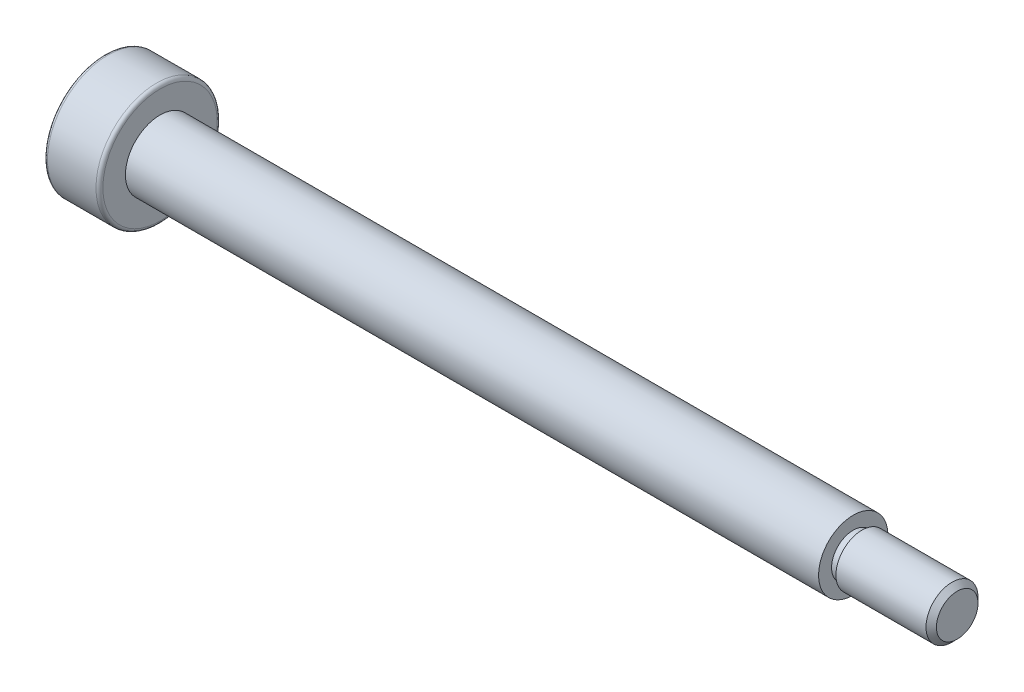
ISO-10303-21;
HEADER;
FILE_DESCRIPTION(('STEP AP214'),'2;1');
FILE_NAME('part.step','',(''),(''),'','','');
FILE_SCHEMA(('AUTOMOTIVE_DESIGN { 1 0 10303 214 1 1 1 1 }'));
ENDSEC;
DATA;
#1=APPLICATION_CONTEXT('core data for automotive mechanical design processes');
#2=APPLICATION_PROTOCOL_DEFINITION('international standard','automotive_design',2000,#1);
#3=PRODUCT_CONTEXT('',#1,'mechanical');
#4=PRODUCT('Part','Part','',(#3));
#5=PRODUCT_RELATED_PRODUCT_CATEGORY('part','',(#4));
#6=PRODUCT_DEFINITION_FORMATION('','',#4);
#7=PRODUCT_DEFINITION_CONTEXT('part definition',#1,'design');
#8=PRODUCT_DEFINITION('design','',#6,#7);
#9=PRODUCT_DEFINITION_SHAPE('','',#8);
#10=(LENGTH_UNIT() NAMED_UNIT(*) SI_UNIT(.MILLI.,.METRE.));
#11=(NAMED_UNIT(*) PLANE_ANGLE_UNIT() SI_UNIT($,.RADIAN.));
#12=(NAMED_UNIT(*) SI_UNIT($,.STERADIAN.) SOLID_ANGLE_UNIT());
#13=UNCERTAINTY_MEASURE_WITH_UNIT(LENGTH_MEASURE(1.E-05),#10,'distance_accuracy_value','');
#14=(GEOMETRIC_REPRESENTATION_CONTEXT(3) GLOBAL_UNCERTAINTY_ASSIGNED_CONTEXT((#13)) GLOBAL_UNIT_ASSIGNED_CONTEXT((#10,
#11,#12)) REPRESENTATION_CONTEXT('',''));
#15=CARTESIAN_POINT('',(0.,0.,0.));
#16=DIRECTION('',(0.,0.,1.));
#17=DIRECTION('',(1.,0.,0.));
#18=AXIS2_PLACEMENT_3D('',#15,#16,#17);
#19=CARTESIAN_POINT('',(-24.6,0.,0.));
#20=DIRECTION('',(1.,0.,0.));
#21=DIRECTION('',(0.,0.,-1.));
#22=AXIS2_PLACEMENT_3D('',#19,#20,#21);
#23=PLANE('',#22);
#24=DIRECTION('',(0.,0.866025403784438,-0.5));
#25=VECTOR('',#24,1.);
#26=CARTESIAN_POINT('',(-24.6,0.,1.73205080756888));
#27=LINE('',#26,#25);
#28=CARTESIAN_POINT('',(-24.6,0.,1.73205080756888));
#29=VERTEX_POINT('',#28);
#30=CARTESIAN_POINT('',(-24.6,1.5,0.866025403784438));
#31=VERTEX_POINT('',#30);
#32=EDGE_CURVE('E127',#29,#31,#27,.T.);
#33=ORIENTED_EDGE('',*,*,#32,.F.);
#34=DIRECTION('',(0.,0.866025403784439,0.5));
#35=VECTOR('',#34,1.);
#36=CARTESIAN_POINT('',(-24.6,-1.5,0.866025403784438));
#37=LINE('',#36,#35);
#38=CARTESIAN_POINT('',(-24.6,-1.5,0.866025403784438));
#39=VERTEX_POINT('',#38);
#40=EDGE_CURVE('E53',#39,#29,#37,.T.);
#41=ORIENTED_EDGE('',*,*,#40,.F.);
#42=DIRECTION('',(0.,0.,1.));
#43=VECTOR('',#42,1.);
#44=CARTESIAN_POINT('',(-24.6,-1.5,-0.866025403784438));
#45=LINE('',#44,#43);
#46=CARTESIAN_POINT('',(-24.6,-1.5,-0.866025403784438));
#47=VERTEX_POINT('',#46);
#48=EDGE_CURVE('E136',#47,#39,#45,.T.);
#49=ORIENTED_EDGE('',*,*,#48,.F.);
#50=DIRECTION('',(0.,-0.866025403784438,0.5));
#51=VECTOR('',#50,1.);
#52=CARTESIAN_POINT('',(-24.6,0.,-1.73205080756888));
#53=LINE('',#52,#51);
#54=CARTESIAN_POINT('',(-24.6,0.,-1.73205080756888));
#55=VERTEX_POINT('',#54);
#56=EDGE_CURVE('E134',#55,#47,#53,.T.);
#57=ORIENTED_EDGE('',*,*,#56,.F.);
#58=DIRECTION('',(0.,-0.866025403784439,-0.5));
#59=VECTOR('',#58,1.);
#60=CARTESIAN_POINT('',(-24.6,1.5,-0.866025403784438));
#61=LINE('',#60,#59);
#62=CARTESIAN_POINT('',(-24.6,1.5,-0.866025403784438));
#63=VERTEX_POINT('',#62);
#64=EDGE_CURVE('E101',#63,#55,#61,.T.);
#65=ORIENTED_EDGE('',*,*,#64,.F.);
#66=DIRECTION('',(0.,0.,-1.));
#67=VECTOR('',#66,1.);
#68=CARTESIAN_POINT('',(-24.6,1.5,0.866025403784438));
#69=LINE('',#68,#67);
#70=EDGE_CURVE('E130',#31,#63,#69,.T.);
#71=ORIENTED_EDGE('',*,*,#70,.F.);
#72=EDGE_LOOP('',(#33,#41,#49,#57,#65,#71));
#73=FACE_BOUND('',#72,.T.);
#74=CARTESIAN_POINT('',(-24.6,0.,0.));
#75=DIRECTION('',(1.,0.,0.));
#76=DIRECTION('',(0.,0.,-1.));
#77=AXIS2_PLACEMENT_3D('',#74,#75,#76);
#78=CIRCLE('',#77,3.3);
#79=CARTESIAN_POINT('',(-24.6,0.,-3.3));
#80=VERTEX_POINT('',#79);
#81=EDGE_CURVE('E169',#80,#80,#78,.F.);
#82=ORIENTED_EDGE('',*,*,#81,.T.);
#83=EDGE_LOOP('',(#82));
#84=FACE_BOUND('',#83,.T.);
#85=ADVANCED_FACE('F37',(#73,#84),#23,.F.);
#86=CARTESIAN_POINT('',(-24.6,0.,0.));
#87=DIRECTION('',(-1.,0.,0.));
#88=DIRECTION('',(0.,0.,1.));
#89=AXIS2_PLACEMENT_3D('',#86,#87,#88);
#90=CYLINDRICAL_SURFACE('',#89,3.5);
#91=CARTESIAN_POINT('',(-21.6,0.,0.));
#92=DIRECTION('',(-1.,0.,0.));
#93=DIRECTION('',(0.,0.,1.));
#94=AXIS2_PLACEMENT_3D('',#91,#92,#93);
#95=CIRCLE('',#94,3.5);
#96=CARTESIAN_POINT('',(-21.6,0.,3.5));
#97=VERTEX_POINT('',#96);
#98=EDGE_CURVE('E163',#97,#97,#95,.T.);
#99=ORIENTED_EDGE('',*,*,#98,.T.);
#100=EDGE_LOOP('',(#99));
#101=FACE_BOUND('',#100,.T.);
#102=CARTESIAN_POINT('',(-24.4,0.,0.));
#103=DIRECTION('',(1.,0.,0.));
#104=DIRECTION('',(0.,0.,-1.));
#105=AXIS2_PLACEMENT_3D('',#102,#103,#104);
#106=CIRCLE('',#105,3.5);
#107=CARTESIAN_POINT('',(-24.4,0.,-3.5));
#108=VERTEX_POINT('',#107);
#109=EDGE_CURVE('E160',#108,#108,#106,.T.);
#110=ORIENTED_EDGE('',*,*,#109,.T.);
#111=EDGE_LOOP('',(#110));
#112=FACE_BOUND('',#111,.T.);
#113=ADVANCED_FACE('F191',(#101,#112),#90,.T.);
#114=CARTESIAN_POINT('',(-21.4,3.5,0.));
#115=DIRECTION('',(-1.,0.,0.));
#116=DIRECTION('',(0.,0.,1.));
#117=AXIS2_PLACEMENT_3D('',#114,#115,#116);
#118=PLANE('',#117);
#119=CARTESIAN_POINT('',(-21.4,0.,0.));
#120=DIRECTION('',(-1.,0.,0.));
#121=DIRECTION('',(0.,0.,1.));
#122=AXIS2_PLACEMENT_3D('',#119,#120,#121);
#123=CIRCLE('',#122,3.3);
#124=CARTESIAN_POINT('',(-21.4,0.,3.3));
#125=VERTEX_POINT('',#124);
#126=EDGE_CURVE('E166',#125,#125,#123,.F.);
#127=ORIENTED_EDGE('',*,*,#126,.T.);
#128=EDGE_LOOP('',(#127));
#129=FACE_BOUND('',#128,.T.);
#130=CARTESIAN_POINT('',(-21.4,0.,0.));
#131=DIRECTION('',(-1.,0.,0.));
#132=DIRECTION('',(0.,0.,1.));
#133=AXIS2_PLACEMENT_3D('',#130,#131,#132);
#134=CIRCLE('',#133,2.);
#135=CARTESIAN_POINT('',(-21.4,0.,2.));
#136=VERTEX_POINT('',#135);
#137=EDGE_CURVE('E157',#136,#136,#134,.T.);
#138=ORIENTED_EDGE('',*,*,#137,.T.);
#139=EDGE_LOOP('',(#138));
#140=FACE_BOUND('',#139,.T.);
#141=ADVANCED_FACE('F197',(#129,#140),#118,.F.);
#142=CARTESIAN_POINT('',(-24.6,0.,0.));
#143=DIRECTION('',(-1.,0.,0.));
#144=DIRECTION('',(0.,0.,1.));
#145=AXIS2_PLACEMENT_3D('',#142,#143,#144);
#146=CYLINDRICAL_SURFACE('',#145,2.);
#147=ORIENTED_EDGE('',*,*,#137,.F.);
#148=EDGE_LOOP('',(#147));
#149=FACE_BOUND('',#148,.T.);
#150=CARTESIAN_POINT('',(18.6,0.,0.));
#151=DIRECTION('',(-1.,0.,0.));
#152=DIRECTION('',(0.,0.,1.));
#153=AXIS2_PLACEMENT_3D('',#150,#151,#152);
#154=CIRCLE('',#153,2.);
#155=CARTESIAN_POINT('',(18.6,0.,2.));
#156=VERTEX_POINT('',#155);
#157=EDGE_CURVE('E154',#156,#156,#154,.T.);
#158=ORIENTED_EDGE('',*,*,#157,.T.);
#159=EDGE_LOOP('',(#158));
#160=FACE_BOUND('',#159,.T.);
#161=ADVANCED_FACE('F231',(#149,#160),#146,.T.);
#162=CARTESIAN_POINT('',(18.6,2.,0.));
#163=DIRECTION('',(-1.,0.,0.));
#164=DIRECTION('',(0.,0.,1.));
#165=AXIS2_PLACEMENT_3D('',#162,#163,#164);
#166=PLANE('',#165);
#167=ORIENTED_EDGE('',*,*,#157,.F.);
#168=EDGE_LOOP('',(#167));
#169=FACE_BOUND('',#168,.T.);
#170=CARTESIAN_POINT('',(18.6,0.,0.));
#171=DIRECTION('',(-1.,0.,0.));
#172=DIRECTION('',(0.,0.,1.));
#173=AXIS2_PLACEMENT_3D('',#170,#171,#172);
#174=CIRCLE('',#173,1.25);
#175=CARTESIAN_POINT('',(18.6,0.,1.25));
#176=VERTEX_POINT('',#175);
#177=EDGE_CURVE('E151',#176,#176,#174,.T.);
#178=ORIENTED_EDGE('',*,*,#177,.T.);
#179=EDGE_LOOP('',(#178));
#180=FACE_BOUND('',#179,.T.);
#181=ADVANCED_FACE('F207',(#169,#180),#166,.F.);
#182=CARTESIAN_POINT('',(-21.6,0.,0.));
#183=DIRECTION('',(-1.,0.,0.));
#184=DIRECTION('',(0.,0.,1.));
#185=AXIS2_PLACEMENT_3D('',#182,#183,#184);
#186=TOROIDAL_SURFACE('',#185,3.3,0.2);
#187=ORIENTED_EDGE('',*,*,#126,.F.);
#188=EDGE_LOOP('',(#187));
#189=FACE_BOUND('',#188,.T.);
#190=ORIENTED_EDGE('',*,*,#98,.F.);
#191=EDGE_LOOP('',(#190));
#192=FACE_BOUND('',#191,.T.);
#193=ADVANCED_FACE('F204',(#189,#192),#186,.T.);
#194=CARTESIAN_POINT('',(-24.4,0.,0.));
#195=DIRECTION('',(1.,0.,0.));
#196=DIRECTION('',(0.,0.,-1.));
#197=AXIS2_PLACEMENT_3D('',#194,#195,#196);
#198=TOROIDAL_SURFACE('',#197,3.3,0.2);
#199=ORIENTED_EDGE('',*,*,#109,.F.);
#200=EDGE_LOOP('',(#199));
#201=FACE_BOUND('',#200,.T.);
#202=ORIENTED_EDGE('',*,*,#81,.F.);
#203=EDGE_LOOP('',(#202));
#204=FACE_BOUND('',#203,.T.);
#205=ADVANCED_FACE('F206',(#201,#204),#198,.T.);
#206=CARTESIAN_POINT('',(18.6,0.,0.));
#207=DIRECTION('',(-1.,0.,0.));
#208=DIRECTION('',(0.,0.,1.));
#209=AXIS2_PLACEMENT_3D('',#206,#207,#208);
#210=CYLINDRICAL_SURFACE('',#209,1.25);
#211=CARTESIAN_POINT('',(19.1,0.,0.));
#212=DIRECTION('',(-1.,0.,0.));
#213=DIRECTION('',(0.,0.,1.));
#214=AXIS2_PLACEMENT_3D('',#211,#212,#213);
#215=CIRCLE('',#214,1.25);
#216=CARTESIAN_POINT('',(19.1,0.,1.25));
#217=VERTEX_POINT('',#216);
#218=EDGE_CURVE('E148',#217,#217,#215,.T.);
#219=ORIENTED_EDGE('',*,*,#218,.T.);
#220=EDGE_LOOP('',(#219));
#221=FACE_BOUND('',#220,.T.);
#222=ORIENTED_EDGE('',*,*,#177,.F.);
#223=EDGE_LOOP('',(#222));
#224=FACE_BOUND('',#223,.T.);
#225=ADVANCED_FACE('F210',(#221,#224),#210,.T.);
#226=CARTESIAN_POINT('',(19.1,1.5,0.));
#227=DIRECTION('',(-1.,0.,0.));
#228=DIRECTION('',(0.,0.,1.));
#229=AXIS2_PLACEMENT_3D('',#226,#227,#228);
#230=PLANE('',#229);
#231=CARTESIAN_POINT('',(19.1,0.,0.));
#232=DIRECTION('',(-1.,0.,0.));
#233=DIRECTION('',(0.,0.,1.));
#234=AXIS2_PLACEMENT_3D('',#231,#232,#233);
#235=CIRCLE('',#234,1.5);
#236=CARTESIAN_POINT('',(19.1,0.,1.5));
#237=VERTEX_POINT('',#236);
#238=EDGE_CURVE('E140',#237,#237,#235,.T.);
#239=ORIENTED_EDGE('',*,*,#238,.T.);
#240=EDGE_LOOP('',(#239));
#241=FACE_BOUND('',#240,.T.);
#242=ORIENTED_EDGE('',*,*,#218,.F.);
#243=EDGE_LOOP('',(#242));
#244=FACE_BOUND('',#243,.T.);
#245=ADVANCED_FACE('F186',(#241,#244),#230,.T.);
#246=CARTESIAN_POINT('',(24.6,1.5,0.));
#247=DIRECTION('',(-1.,0.,0.));
#248=DIRECTION('',(0.,0.,1.));
#249=AXIS2_PLACEMENT_3D('',#246,#247,#248);
#250=PLANE('',#249);
#251=CARTESIAN_POINT('',(24.6,0.,0.));
#252=DIRECTION('',(-1.,0.,0.));
#253=DIRECTION('',(0.,0.,1.));
#254=AXIS2_PLACEMENT_3D('',#251,#252,#253);
#255=CIRCLE('',#254,1.2);
#256=CARTESIAN_POINT('',(24.6,0.,1.2));
#257=VERTEX_POINT('',#256);
#258=EDGE_CURVE('E11',#257,#257,#255,.F.);
#259=ORIENTED_EDGE('',*,*,#258,.T.);
#260=EDGE_LOOP('',(#259));
#261=FACE_BOUND('',#260,.T.);
#262=ADVANCED_FACE('F178',(#261),#250,.F.);
#263=CARTESIAN_POINT('',(24.3,0.,0.));
#264=DIRECTION('',(-1.,0.,0.));
#265=DIRECTION('',(0.,0.,1.));
#266=AXIS2_PLACEMENT_3D('',#263,#264,#265);
#267=CONICAL_SURFACE('',#266,1.5,0.785398163397447);
#268=ORIENTED_EDGE('',*,*,#258,.F.);
#269=EDGE_LOOP('',(#268));
#270=FACE_BOUND('',#269,.T.);
#271=CARTESIAN_POINT('',(24.3,0.,0.));
#272=DIRECTION('',(-1.,0.,0.));
#273=DIRECTION('',(0.,0.,1.));
#274=AXIS2_PLACEMENT_3D('',#271,#272,#273);
#275=CIRCLE('',#274,1.5);
#276=CARTESIAN_POINT('',(24.3,0.,1.5));
#277=VERTEX_POINT('',#276);
#278=EDGE_CURVE('E46',#277,#277,#275,.T.);
#279=ORIENTED_EDGE('',*,*,#278,.F.);
#280=EDGE_LOOP('',(#279));
#281=FACE_BOUND('',#280,.T.);
#282=ADVANCED_FACE('F40',(#270,#281),#267,.T.);
#283=CARTESIAN_POINT('',(-24.6,0.,0.));
#284=DIRECTION('',(-1.,0.,0.));
#285=DIRECTION('',(0.,0.,1.));
#286=AXIS2_PLACEMENT_3D('',#283,#284,#285);
#287=CYLINDRICAL_SURFACE('',#286,1.5);
#288=ORIENTED_EDGE('',*,*,#278,.T.);
#289=EDGE_LOOP('',(#288));
#290=FACE_BOUND('',#289,.T.);
#291=ORIENTED_EDGE('',*,*,#238,.F.);
#292=EDGE_LOOP('',(#291));
#293=FACE_BOUND('',#292,.T.);
#294=ADVANCED_FACE('F174',(#290,#293),#287,.T.);
#295=CARTESIAN_POINT('',(-22.6,-1.5,0.866025403784438));
#296=DIRECTION('',(0.,-0.5,0.866025403784439));
#297=DIRECTION('',(0.,-0.866025403784439,-0.5));
#298=AXIS2_PLACEMENT_3D('',#295,#296,#297);
#299=PLANE('',#298);
#300=ORIENTED_EDGE('',*,*,#40,.T.);
#301=DIRECTION('',(-1.,0.,0.));
#302=VECTOR('',#301,1.);
#303=CARTESIAN_POINT('',(-22.6,0.,1.73205080756888));
#304=LINE('',#303,#302);
#305=CARTESIAN_POINT('',(-22.6,0.,1.73205080756888));
#306=VERTEX_POINT('',#305);
#307=EDGE_CURVE('E83',#306,#29,#304,.T.);
#308=ORIENTED_EDGE('',*,*,#307,.F.);
#309=DIRECTION('',(0.,0.866025403784439,0.5));
#310=VECTOR('',#309,1.);
#311=CARTESIAN_POINT('',(-22.6,-1.5,0.866025403784438));
#312=LINE('',#311,#310);
#313=CARTESIAN_POINT('',(-22.6,-1.5,0.866025403784438));
#314=VERTEX_POINT('',#313);
#315=EDGE_CURVE('E138',#314,#306,#312,.T.);
#316=ORIENTED_EDGE('',*,*,#315,.F.);
#317=DIRECTION('',(-1.,0.,0.));
#318=VECTOR('',#317,1.);
#319=CARTESIAN_POINT('',(-22.6,-1.5,0.866025403784438));
#320=LINE('',#319,#318);
#321=EDGE_CURVE('E61',#314,#39,#320,.T.);
#322=ORIENTED_EDGE('',*,*,#321,.T.);
#323=EDGE_LOOP('',(#300,#308,#316,#322));
#324=FACE_BOUND('',#323,.T.);
#325=ADVANCED_FACE('F184',(#324),#299,.F.);
#326=CARTESIAN_POINT('',(-22.6,-1.5,-0.866025403784438));
#327=DIRECTION('',(0.,-1.,0.));
#328=DIRECTION('',(0.,0.,-1.));
#329=AXIS2_PLACEMENT_3D('',#326,#327,#328);
#330=PLANE('',#329);
#331=ORIENTED_EDGE('',*,*,#48,.T.);
#332=ORIENTED_EDGE('',*,*,#321,.F.);
#333=DIRECTION('',(0.,0.,1.));
#334=VECTOR('',#333,1.);
#335=CARTESIAN_POINT('',(-22.6,-1.5,-0.866025403784438));
#336=LINE('',#335,#334);
#337=CARTESIAN_POINT('',(-22.6,-1.5,-0.866025403784438));
#338=VERTEX_POINT('',#337);
#339=EDGE_CURVE('E113',#338,#314,#336,.T.);
#340=ORIENTED_EDGE('',*,*,#339,.F.);
#341=DIRECTION('',(-1.,0.,0.));
#342=VECTOR('',#341,1.);
#343=CARTESIAN_POINT('',(-22.6,-1.5,-0.866025403784438));
#344=LINE('',#343,#342);
#345=EDGE_CURVE('E105',#338,#47,#344,.T.);
#346=ORIENTED_EDGE('',*,*,#345,.T.);
#347=EDGE_LOOP('',(#331,#332,#340,#346));
#348=FACE_BOUND('',#347,.T.);
#349=ADVANCED_FACE('F305',(#348),#330,.F.);
#350=CARTESIAN_POINT('',(-22.6,0.,-1.73205080756888));
#351=DIRECTION('',(0.,-0.5,-0.866025403784438));
#352=DIRECTION('',(0.,0.866025403784439,-0.5));
#353=AXIS2_PLACEMENT_3D('',#350,#351,#352);
#354=PLANE('',#353);
#355=ORIENTED_EDGE('',*,*,#56,.T.);
#356=ORIENTED_EDGE('',*,*,#345,.F.);
#357=DIRECTION('',(0.,-0.866025403784438,0.5));
#358=VECTOR('',#357,1.);
#359=CARTESIAN_POINT('',(-22.6,0.,-1.73205080756888));
#360=LINE('',#359,#358);
#361=CARTESIAN_POINT('',(-22.6,0.,-1.73205080756888));
#362=VERTEX_POINT('',#361);
#363=EDGE_CURVE('E109',#362,#338,#360,.T.);
#364=ORIENTED_EDGE('',*,*,#363,.F.);
#365=DIRECTION('',(-1.,0.,0.));
#366=VECTOR('',#365,1.);
#367=CARTESIAN_POINT('',(-22.6,0.,-1.73205080756888));
#368=LINE('',#367,#366);
#369=EDGE_CURVE('E94',#362,#55,#368,.T.);
#370=ORIENTED_EDGE('',*,*,#369,.T.);
#371=EDGE_LOOP('',(#355,#356,#364,#370));
#372=FACE_BOUND('',#371,.T.);
#373=ADVANCED_FACE('F110',(#372),#354,.F.);
#374=CARTESIAN_POINT('',(-22.6,1.5,-0.866025403784438));
#375=DIRECTION('',(0.,0.5,-0.866025403784439));
#376=DIRECTION('',(0.,0.866025403784439,0.5));
#377=AXIS2_PLACEMENT_3D('',#374,#375,#376);
#378=PLANE('',#377);
#379=ORIENTED_EDGE('',*,*,#64,.T.);
#380=ORIENTED_EDGE('',*,*,#369,.F.);
#381=DIRECTION('',(0.,-0.866025403784439,-0.5));
#382=VECTOR('',#381,1.);
#383=CARTESIAN_POINT('',(-22.6,1.5,-0.866025403784438));
#384=LINE('',#383,#382);
#385=CARTESIAN_POINT('',(-22.6,1.5,-0.866025403784438));
#386=VERTEX_POINT('',#385);
#387=EDGE_CURVE('E98',#386,#362,#384,.T.);
#388=ORIENTED_EDGE('',*,*,#387,.F.);
#389=DIRECTION('',(-1.,0.,0.));
#390=VECTOR('',#389,1.);
#391=CARTESIAN_POINT('',(-22.6,1.5,-0.866025403784438));
#392=LINE('',#391,#390);
#393=EDGE_CURVE('E106',#386,#63,#392,.T.);
#394=ORIENTED_EDGE('',*,*,#393,.T.);
#395=EDGE_LOOP('',(#379,#380,#388,#394));
#396=FACE_BOUND('',#395,.T.);
#397=ADVANCED_FACE('F96',(#396),#378,.F.);
#398=CARTESIAN_POINT('',(-22.6,1.5,0.866025403784438));
#399=DIRECTION('',(0.,1.,0.));
#400=DIRECTION('',(0.,0.,1.));
#401=AXIS2_PLACEMENT_3D('',#398,#399,#400);
#402=PLANE('',#401);
#403=ORIENTED_EDGE('',*,*,#70,.T.);
#404=ORIENTED_EDGE('',*,*,#393,.F.);
#405=DIRECTION('',(0.,0.,-1.));
#406=VECTOR('',#405,1.);
#407=CARTESIAN_POINT('',(-22.6,1.5,0.866025403784438));
#408=LINE('',#407,#406);
#409=CARTESIAN_POINT('',(-22.6,1.5,0.866025403784438));
#410=VERTEX_POINT('',#409);
#411=EDGE_CURVE('E119',#410,#386,#408,.T.);
#412=ORIENTED_EDGE('',*,*,#411,.F.);
#413=DIRECTION('',(-1.,0.,0.));
#414=VECTOR('',#413,1.);
#415=CARTESIAN_POINT('',(-22.6,1.5,0.866025403784438));
#416=LINE('',#415,#414);
#417=EDGE_CURVE('E143',#410,#31,#416,.T.);
#418=ORIENTED_EDGE('',*,*,#417,.T.);
#419=EDGE_LOOP('',(#403,#404,#412,#418));
#420=FACE_BOUND('',#419,.T.);
#421=ADVANCED_FACE('F326',(#420),#402,.F.);
#422=CARTESIAN_POINT('',(-22.6,0.,1.73205080756888));
#423=DIRECTION('',(0.,0.5,0.866025403784438));
#424=DIRECTION('',(0.,-0.866025403784439,0.5));
#425=AXIS2_PLACEMENT_3D('',#422,#423,#424);
#426=PLANE('',#425);
#427=ORIENTED_EDGE('',*,*,#32,.T.);
#428=ORIENTED_EDGE('',*,*,#417,.F.);
#429=DIRECTION('',(0.,0.866025403784438,-0.5));
#430=VECTOR('',#429,1.);
#431=CARTESIAN_POINT('',(-22.6,0.,1.73205080756888));
#432=LINE('',#431,#430);
#433=EDGE_CURVE('E121',#306,#410,#432,.T.);
#434=ORIENTED_EDGE('',*,*,#433,.F.);
#435=ORIENTED_EDGE('',*,*,#307,.T.);
#436=EDGE_LOOP('',(#427,#428,#434,#435));
#437=FACE_BOUND('',#436,.T.);
#438=ADVANCED_FACE('F334',(#437),#426,.F.);
#439=CARTESIAN_POINT('',(-22.6,0.,0.));
#440=DIRECTION('',(-1.,0.,0.));
#441=DIRECTION('',(0.,0.,1.));
#442=AXIS2_PLACEMENT_3D('',#439,#440,#441);
#443=PLANE('',#442);
#444=ORIENTED_EDGE('',*,*,#315,.T.);
#445=ORIENTED_EDGE('',*,*,#433,.T.);
#446=ORIENTED_EDGE('',*,*,#411,.T.);
#447=ORIENTED_EDGE('',*,*,#387,.T.);
#448=ORIENTED_EDGE('',*,*,#363,.T.);
#449=ORIENTED_EDGE('',*,*,#339,.T.);
#450=EDGE_LOOP('',(#444,#445,#446,#447,#448,#449));
#451=FACE_BOUND('',#450,.T.);
#452=ADVANCED_FACE('F116',(#451),#443,.T.);
#453=CLOSED_SHELL('',(#85,#113,#141,#161,#181,#193,#205,#225,#245,#262,#282,#294,#325,#349,#373,
#397,#421,#438,#452));
#454=MANIFOLD_SOLID_BREP('B2',#453);
#455=ADVANCED_BREP_SHAPE_REPRESENTATION('',(#18,#454),#14);
#456=SHAPE_DEFINITION_REPRESENTATION(#9,#455);
ENDSEC;
END-ISO-10303-21;
